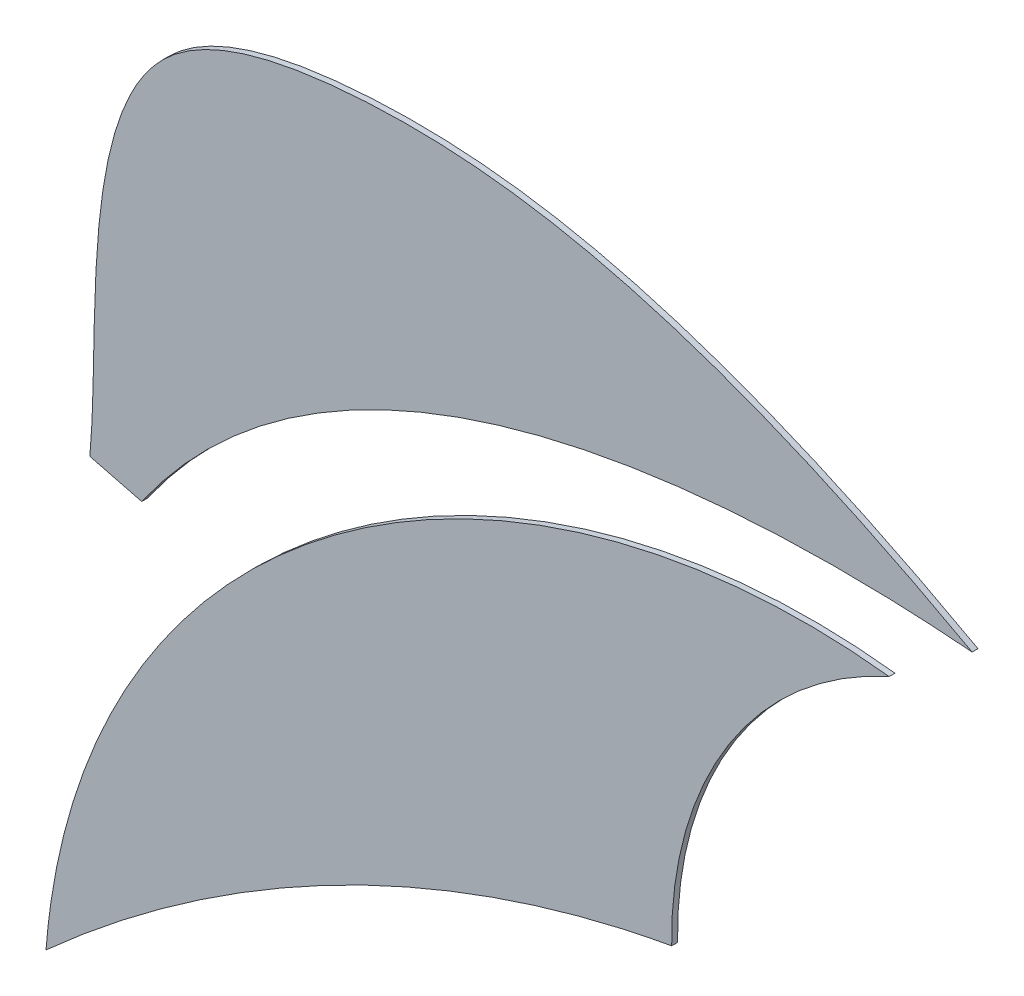
ISO-10303-21;
HEADER;
FILE_DESCRIPTION(('STEP AP214'),'2;1');
FILE_NAME('part.step','',(''),(''),'','','');
FILE_SCHEMA(('AUTOMOTIVE_DESIGN { 1 0 10303 214 1 1 1 1 }'));
ENDSEC;
DATA;
#1=APPLICATION_CONTEXT('core data for automotive mechanical design processes');
#2=APPLICATION_PROTOCOL_DEFINITION('international standard','automotive_design',2000,#1);
#3=PRODUCT_CONTEXT('',#1,'mechanical');
#4=PRODUCT('Part','Part','',(#3));
#5=PRODUCT_RELATED_PRODUCT_CATEGORY('part','',(#4));
#6=PRODUCT_DEFINITION_FORMATION('','',#4);
#7=PRODUCT_DEFINITION_CONTEXT('part definition',#1,'design');
#8=PRODUCT_DEFINITION('design','',#6,#7);
#9=PRODUCT_DEFINITION_SHAPE('','',#8);
#10=(LENGTH_UNIT() NAMED_UNIT(*) SI_UNIT(.MILLI.,.METRE.));
#11=(NAMED_UNIT(*) PLANE_ANGLE_UNIT() SI_UNIT($,.RADIAN.));
#12=(NAMED_UNIT(*) SI_UNIT($,.STERADIAN.) SOLID_ANGLE_UNIT());
#13=UNCERTAINTY_MEASURE_WITH_UNIT(LENGTH_MEASURE(1.E-05),#10,'distance_accuracy_value','');
#14=(GEOMETRIC_REPRESENTATION_CONTEXT(3) GLOBAL_UNCERTAINTY_ASSIGNED_CONTEXT((#13)) GLOBAL_UNIT_ASSIGNED_CONTEXT((#10,
#11,#12)) REPRESENTATION_CONTEXT('',''));
#15=CARTESIAN_POINT('',(0.,0.,0.));
#16=DIRECTION('',(0.,0.,1.));
#17=DIRECTION('',(1.,0.,0.));
#18=AXIS2_PLACEMENT_3D('',#15,#16,#17);
#19=CARTESIAN_POINT('',(21.4529551268361,55.5037477207612,0.6));
#20=CARTESIAN_POINT('',(40.1498186225957,82.2122812940596,0.6));
#21=CARTESIAN_POINT('',(76.3866247202044,87.0492950690195,0.6));
#22=CARTESIAN_POINT('',(106.262087238413,84.5949857002796,0.6));
#23=B_SPLINE_CURVE_WITH_KNOTS('',3,(#19,#20,#21,#22),.UNSPECIFIED.,.F.,.F.,(4,4),(0.,1.),.UNSPECIFIED.);
#24=DIRECTION('',(0.,0.,-1.));
#25=VECTOR('',#24,1.);
#26=SURFACE_OF_LINEAR_EXTRUSION('',#23,#25);
#27=CARTESIAN_POINT('',(21.4529551268361,55.5037477207612,0.));
#28=CARTESIAN_POINT('',(40.1498186225957,82.2122812940596,0.));
#29=CARTESIAN_POINT('',(76.3866247202044,87.0492950690195,0.));
#30=CARTESIAN_POINT('',(106.262087238413,84.5949857002796,0.));
#31=B_SPLINE_CURVE_WITH_KNOTS('',3,(#27,#28,#29,#30),.UNSPECIFIED.,.F.,.F.,(4,4),(0.,1.),.UNSPECIFIED.);
#32=CARTESIAN_POINT('',(21.4529551268361,55.5037477207612,0.));
#33=VERTEX_POINT('',#32);
#34=CARTESIAN_POINT('',(106.262087238413,84.5949857002796,0.));
#35=VERTEX_POINT('',#34);
#36=EDGE_CURVE('E12',#33,#35,#31,.T.);
#37=ORIENTED_EDGE('',*,*,#36,.T.);
#38=DIRECTION('',(0.,0.,-1.));
#39=VECTOR('',#38,1.);
#40=CARTESIAN_POINT('',(106.262087238413,84.5949857002796,0.6));
#41=LINE('',#40,#39);
#42=CARTESIAN_POINT('',(106.262087238413,84.5949857002796,0.6));
#43=VERTEX_POINT('',#42);
#44=EDGE_CURVE('E137',#43,#35,#41,.T.);
#45=ORIENTED_EDGE('',*,*,#44,.F.);
#46=CARTESIAN_POINT('',(21.4529551268361,55.5037477207612,0.6));
#47=VERTEX_POINT('',#46);
#48=EDGE_CURVE('E55',#47,#43,#23,.T.);
#49=ORIENTED_EDGE('',*,*,#48,.F.);
#50=DIRECTION('',(0.,0.,-1.));
#51=VECTOR('',#50,1.);
#52=CARTESIAN_POINT('',(21.4529551268361,55.5037477207612,0.6));
#53=LINE('',#52,#51);
#54=EDGE_CURVE('E96',#47,#33,#53,.T.);
#55=ORIENTED_EDGE('',*,*,#54,.T.);
#56=EDGE_LOOP('',(#37,#45,#49,#55));
#57=FACE_BOUND('',#56,.T.);
#58=ADVANCED_FACE('F51',(#57),#26,.F.);
#59=CARTESIAN_POINT('',(106.262087238413,84.5949857002796,0.6));
#60=CARTESIAN_POINT('',(94.6420599193922,90.9758008392093,0.6));
#61=CARTESIAN_POINT('',(73.773985669896,100.524100710988,0.6));
#62=CARTESIAN_POINT('',(45.7325473598618,103.606241894499,0.6));
#63=CARTESIAN_POINT('',(13.617789334472,97.3261218827625,0.6));
#64=CARTESIAN_POINT('',(17.2527225304574,67.8773913535739,0.6));
#65=CARTESIAN_POINT('',(16.15512727014,56.8468590083743,0.6));
#66=B_SPLINE_CURVE_WITH_KNOTS('',3,(#59,#60,#61,#62,#63,#64,#65),.UNSPECIFIED.,.F.,.F.,(4,1,1,1,
4),(0.,0.317400284735793,0.524814146599707,0.681364649496986,1.),.UNSPECIFIED.);
#67=DIRECTION('',(0.,0.,-1.));
#68=VECTOR('',#67,1.);
#69=SURFACE_OF_LINEAR_EXTRUSION('',#66,#68);
#70=CARTESIAN_POINT('',(106.262087238413,84.5949857002796,0.));
#71=CARTESIAN_POINT('',(94.6420599193922,90.9758008392093,0.));
#72=CARTESIAN_POINT('',(73.773985669896,100.524100710988,0.));
#73=CARTESIAN_POINT('',(45.7325473598618,103.606241894499,0.));
#74=CARTESIAN_POINT('',(13.617789334472,97.3261218827625,0.));
#75=CARTESIAN_POINT('',(17.2527225304574,67.8773913535739,0.));
#76=CARTESIAN_POINT('',(16.15512727014,56.8468590083743,0.));
#77=B_SPLINE_CURVE_WITH_KNOTS('',3,(#70,#71,#72,#73,#74,#75,#76),.UNSPECIFIED.,.F.,.F.,(4,1,1,1,
4),(0.,0.317400284735793,0.524814146599707,0.681364649496986,1.),.UNSPECIFIED.);
#78=CARTESIAN_POINT('',(16.15512727014,56.8468590083743,0.));
#79=VERTEX_POINT('',#78);
#80=EDGE_CURVE('E64',#35,#79,#77,.T.);
#81=ORIENTED_EDGE('',*,*,#80,.T.);
#82=DIRECTION('',(0.,0.,-1.));
#83=VECTOR('',#82,1.);
#84=CARTESIAN_POINT('',(16.15512727014,56.8468590083743,0.6));
#85=LINE('',#84,#83);
#86=CARTESIAN_POINT('',(16.15512727014,56.8468590083743,0.6));
#87=VERTEX_POINT('',#86);
#88=EDGE_CURVE('E98',#87,#79,#85,.T.);
#89=ORIENTED_EDGE('',*,*,#88,.F.);
#90=EDGE_CURVE('E85',#43,#87,#66,.T.);
#91=ORIENTED_EDGE('',*,*,#90,.F.);
#92=ORIENTED_EDGE('',*,*,#44,.T.);
#93=EDGE_LOOP('',(#81,#89,#91,#92));
#94=FACE_BOUND('',#93,.T.);
#95=ADVANCED_FACE('F111',(#94),#69,.F.);
#96=CARTESIAN_POINT('',(16.15512727014,56.8468590083743,0.6));
#97=DIRECTION('',(0.24574667018836,0.969334087965204,0.));
#98=DIRECTION('',(-0.969334087965204,0.24574667018836,0.));
#99=AXIS2_PLACEMENT_3D('',#96,#97,#98);
#100=PLANE('',#99);
#101=DIRECTION('',(0.969334087965204,-0.24574667018836,0.));
#102=VECTOR('',#101,1.);
#103=CARTESIAN_POINT('',(16.15512727014,56.8468590083743,0.));
#104=LINE('',#103,#102);
#105=EDGE_CURVE('E92',#79,#33,#104,.T.);
#106=ORIENTED_EDGE('',*,*,#105,.T.);
#107=ORIENTED_EDGE('',*,*,#54,.F.);
#108=DIRECTION('',(0.969334087965204,-0.24574667018836,0.));
#109=VECTOR('',#108,1.);
#110=CARTESIAN_POINT('',(16.15512727014,56.8468590083743,0.6));
#111=LINE('',#110,#109);
#112=EDGE_CURVE('E102',#87,#47,#111,.T.);
#113=ORIENTED_EDGE('',*,*,#112,.F.);
#114=ORIENTED_EDGE('',*,*,#88,.T.);
#115=EDGE_LOOP('',(#106,#107,#113,#114));
#116=FACE_BOUND('',#115,.T.);
#117=ADVANCED_FACE('F94',(#116),#100,.F.);
#118=CARTESIAN_POINT('',(59.6655465492062,80.9854328137848,0.6));
#119=DIRECTION('',(0.,0.,1.));
#120=DIRECTION('',(1.,0.,0.));
#121=AXIS2_PLACEMENT_3D('',#118,#119,#120);
#122=PLANE('',#121);
#123=ORIENTED_EDGE('',*,*,#48,.T.);
#124=ORIENTED_EDGE('',*,*,#90,.T.);
#125=ORIENTED_EDGE('',*,*,#112,.T.);
#126=EDGE_LOOP('',(#123,#124,#125));
#127=FACE_BOUND('',#126,.T.);
#128=ADVANCED_FACE('F53',(#127),#122,.T.);
#129=CARTESIAN_POINT('',(59.6655465492062,80.9854328137848,0.));
#130=DIRECTION('',(0.,0.,1.));
#131=DIRECTION('',(1.,0.,0.));
#132=AXIS2_PLACEMENT_3D('',#129,#130,#131);
#133=PLANE('',#132);
#134=ORIENTED_EDGE('',*,*,#36,.F.);
#135=ORIENTED_EDGE('',*,*,#105,.F.);
#136=ORIENTED_EDGE('',*,*,#80,.F.);
#137=EDGE_LOOP('',(#134,#135,#136));
#138=FACE_BOUND('',#137,.T.);
#139=ADVANCED_FACE('F104',(#138),#133,.F.);
#140=CLOSED_SHELL('',(#58,#95,#117,#128,#139));
#141=MANIFOLD_SOLID_BREP('B2',#140);
#142=CARTESIAN_POINT('',(97.7864466395136,78.1874050226713,0.6));
#143=CARTESIAN_POINT('',(57.690236829036,82.8687250737309,0.6));
#144=CARTESIAN_POINT('',(14.9849881351401,53.3458728738134,0.6));
#145=CARTESIAN_POINT('',(11.678089644763,10.9572233482603,0.6));
#146=B_SPLINE_CURVE_WITH_KNOTS('',3,(#142,#143,#144,#145),.UNSPECIFIED.,.F.,.F.,(4,4),(0.,1.),.UNSPECIFIED.);
#147=DIRECTION('',(0.,0.,-1.));
#148=VECTOR('',#147,1.);
#149=SURFACE_OF_LINEAR_EXTRUSION('',#146,#148);
#150=CARTESIAN_POINT('',(97.7864466395136,78.1874050226713,0.));
#151=CARTESIAN_POINT('',(57.690236829036,82.8687250737309,0.));
#152=CARTESIAN_POINT('',(14.9849881351401,53.3458728738134,0.));
#153=CARTESIAN_POINT('',(11.678089644763,10.9572233482603,0.));
#154=B_SPLINE_CURVE_WITH_KNOTS('',3,(#150,#151,#152,#153),.UNSPECIFIED.,.F.,.F.,(4,4),(0.,1.),.UNSPECIFIED.);
#155=CARTESIAN_POINT('',(97.7864466395136,78.1874050226712,0.));
#156=VERTEX_POINT('',#155);
#157=CARTESIAN_POINT('',(11.678089644763,10.9572233482603,0.));
#158=VERTEX_POINT('',#157);
#159=EDGE_CURVE('E218',#156,#158,#154,.T.);
#160=ORIENTED_EDGE('',*,*,#159,.T.);
#161=DIRECTION('',(0.,0.,-1.));
#162=VECTOR('',#161,1.);
#163=CARTESIAN_POINT('',(11.678089644763,10.9572233482603,0.6));
#164=LINE('',#163,#162);
#165=CARTESIAN_POINT('',(11.678089644763,10.9572233482603,0.6));
#166=VERTEX_POINT('',#165);
#167=EDGE_CURVE('E49',#166,#158,#164,.T.);
#168=ORIENTED_EDGE('',*,*,#167,.F.);
#169=CARTESIAN_POINT('',(97.7864466395136,78.1874050226712,0.6));
#170=VERTEX_POINT('',#169);
#171=EDGE_CURVE('E212',#170,#166,#146,.T.);
#172=ORIENTED_EDGE('',*,*,#171,.F.);
#173=DIRECTION('',(0.,0.,-1.));
#174=VECTOR('',#173,1.);
#175=CARTESIAN_POINT('',(97.7864466395136,78.1874050226712,0.6));
#176=LINE('',#175,#174);
#177=EDGE_CURVE('E219',#170,#156,#176,.T.);
#178=ORIENTED_EDGE('',*,*,#177,.T.);
#179=EDGE_LOOP('',(#160,#168,#172,#178));
#180=FACE_BOUND('',#179,.T.);
#181=ADVANCED_FACE('F171',(#180),#149,.F.);
#182=CARTESIAN_POINT('',(11.678089644763,10.9572233482603,0.6));
#183=CARTESIAN_POINT('',(29.6037583990068,27.0754913472325,0.6));
#184=CARTESIAN_POINT('',(51.7024948366924,38.9870246574332,0.6));
#185=CARTESIAN_POINT('',(75.5790118602837,43.268179528573,0.6));
#186=B_SPLINE_CURVE_WITH_KNOTS('',3,(#182,#183,#184,#185),.UNSPECIFIED.,.F.,.F.,(4,4),(0.,1.),.UNSPECIFIED.);
#187=DIRECTION('',(0.,0.,-1.));
#188=VECTOR('',#187,1.);
#189=SURFACE_OF_LINEAR_EXTRUSION('',#186,#188);
#190=CARTESIAN_POINT('',(11.678089644763,10.9572233482603,0.));
#191=CARTESIAN_POINT('',(29.6037583990068,27.0754913472325,0.));
#192=CARTESIAN_POINT('',(51.7024948366924,38.9870246574332,0.));
#193=CARTESIAN_POINT('',(75.5790118602837,43.268179528573,0.));
#194=B_SPLINE_CURVE_WITH_KNOTS('',3,(#190,#191,#192,#193),.UNSPECIFIED.,.F.,.F.,(4,4),(0.,1.),.UNSPECIFIED.);
#195=CARTESIAN_POINT('',(75.5790118602837,43.268179528573,0.));
#196=VERTEX_POINT('',#195);
#197=EDGE_CURVE('E200',#158,#196,#194,.T.);
#198=ORIENTED_EDGE('',*,*,#197,.T.);
#199=DIRECTION('',(0.,0.,-1.));
#200=VECTOR('',#199,1.);
#201=CARTESIAN_POINT('',(75.5790118602837,43.268179528573,0.6));
#202=LINE('',#201,#200);
#203=CARTESIAN_POINT('',(75.5790118602837,43.268179528573,0.6));
#204=VERTEX_POINT('',#203);
#205=EDGE_CURVE('E180',#204,#196,#202,.T.);
#206=ORIENTED_EDGE('',*,*,#205,.F.);
#207=EDGE_CURVE('E208',#166,#204,#186,.T.);
#208=ORIENTED_EDGE('',*,*,#207,.F.);
#209=ORIENTED_EDGE('',*,*,#167,.T.);
#210=EDGE_LOOP('',(#198,#206,#208,#209));
#211=FACE_BOUND('',#210,.T.);
#212=ADVANCED_FACE('F209',(#211),#189,.F.);
#213=CARTESIAN_POINT('',(113.180223453903,43.8762909601679,0.6));
#214=DIRECTION('',(0.,0.,-1.));
#215=DIRECTION('',(-1.,0.,0.));
#216=AXIS2_PLACEMENT_3D('',#213,#214,#215);
#217=CYLINDRICAL_SURFACE('',#216,37.6061286603837);
#218=CARTESIAN_POINT('',(113.180223453903,43.8762909601679,0.));
#219=DIRECTION('',(0.,0.,-1.));
#220=DIRECTION('',(1.,0.,0.));
#221=AXIS2_PLACEMENT_3D('',#218,#219,#220);
#222=CIRCLE('',#221,37.6061286603837);
#223=EDGE_CURVE('E205',#196,#156,#222,.T.);
#224=ORIENTED_EDGE('',*,*,#223,.T.);
#225=ORIENTED_EDGE('',*,*,#177,.F.);
#226=CARTESIAN_POINT('',(113.180223453903,43.8762909601679,0.6));
#227=DIRECTION('',(0.,0.,-1.));
#228=DIRECTION('',(1.,0.,0.));
#229=AXIS2_PLACEMENT_3D('',#226,#227,#228);
#230=CIRCLE('',#229,37.6061286603837);
#231=EDGE_CURVE('E188',#204,#170,#230,.T.);
#232=ORIENTED_EDGE('',*,*,#231,.F.);
#233=ORIENTED_EDGE('',*,*,#205,.T.);
#234=EDGE_LOOP('',(#224,#225,#232,#233));
#235=FACE_BOUND('',#234,.T.);
#236=ADVANCED_FACE('F236',(#235),#217,.F.);
#237=CARTESIAN_POINT('',(40.9362763971006,62.2235527766955,0.6));
#238=DIRECTION('',(0.,0.,-1.));
#239=DIRECTION('',(-1.,0.,0.));
#240=AXIS2_PLACEMENT_3D('',#237,#238,#239);
#241=PLANE('',#240);
#242=ORIENTED_EDGE('',*,*,#171,.T.);
#243=ORIENTED_EDGE('',*,*,#207,.T.);
#244=ORIENTED_EDGE('',*,*,#231,.T.);
#245=EDGE_LOOP('',(#242,#243,#244));
#246=FACE_BOUND('',#245,.T.);
#247=ADVANCED_FACE('F215',(#246),#241,.F.);
#248=CARTESIAN_POINT('',(40.9362763971006,62.2235527766955,0.));
#249=DIRECTION('',(0.,0.,-1.));
#250=DIRECTION('',(-1.,0.,0.));
#251=AXIS2_PLACEMENT_3D('',#248,#249,#250);
#252=PLANE('',#251);
#253=ORIENTED_EDGE('',*,*,#159,.F.);
#254=ORIENTED_EDGE('',*,*,#223,.F.);
#255=ORIENTED_EDGE('',*,*,#197,.F.);
#256=EDGE_LOOP('',(#253,#254,#255));
#257=FACE_BOUND('',#256,.T.);
#258=ADVANCED_FACE('F237',(#257),#252,.T.);
#259=CLOSED_SHELL('',(#181,#212,#236,#247,#258));
#260=MANIFOLD_SOLID_BREP('B6',#259);
#261=ADVANCED_BREP_SHAPE_REPRESENTATION('',(#18,#141,#260),#14);
#262=SHAPE_DEFINITION_REPRESENTATION(#9,#261);
ENDSEC;
END-ISO-10303-21;
